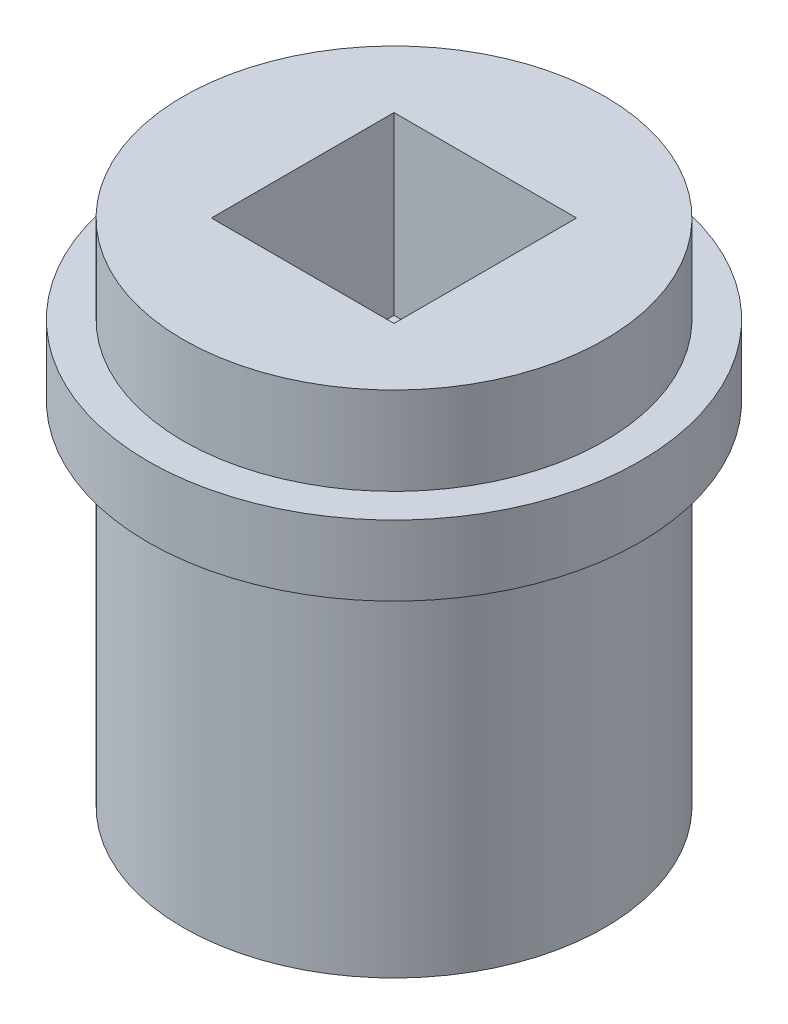
ISO-10303-21;
HEADER;
FILE_DESCRIPTION(('STEP AP214'),'2;1');
FILE_NAME('part.step','',(''),(''),'','','');
FILE_SCHEMA(('AUTOMOTIVE_DESIGN { 1 0 10303 214 1 1 1 1 }'));
ENDSEC;
DATA;
#1=APPLICATION_CONTEXT('core data for automotive mechanical design processes');
#2=APPLICATION_PROTOCOL_DEFINITION('international standard','automotive_design',2000,#1);
#3=PRODUCT_CONTEXT('',#1,'mechanical');
#4=PRODUCT('Part','Part','',(#3));
#5=PRODUCT_RELATED_PRODUCT_CATEGORY('part','',(#4));
#6=PRODUCT_DEFINITION_FORMATION('','',#4);
#7=PRODUCT_DEFINITION_CONTEXT('part definition',#1,'design');
#8=PRODUCT_DEFINITION('design','',#6,#7);
#9=PRODUCT_DEFINITION_SHAPE('','',#8);
#10=(LENGTH_UNIT() NAMED_UNIT(*) SI_UNIT(.MILLI.,.METRE.));
#11=(NAMED_UNIT(*) PLANE_ANGLE_UNIT() SI_UNIT($,.RADIAN.));
#12=(NAMED_UNIT(*) SI_UNIT($,.STERADIAN.) SOLID_ANGLE_UNIT());
#13=UNCERTAINTY_MEASURE_WITH_UNIT(LENGTH_MEASURE(1.E-05),#10,'distance_accuracy_value','');
#14=(GEOMETRIC_REPRESENTATION_CONTEXT(3) GLOBAL_UNCERTAINTY_ASSIGNED_CONTEXT((#13)) GLOBAL_UNIT_ASSIGNED_CONTEXT((#10,
#11,#12)) REPRESENTATION_CONTEXT('',''));
#15=CARTESIAN_POINT('',(0.,0.,0.));
#16=DIRECTION('',(0.,0.,1.));
#17=DIRECTION('',(1.,0.,0.));
#18=AXIS2_PLACEMENT_3D('',#15,#16,#17);
#19=CARTESIAN_POINT('',(0.,7.25,0.));
#20=DIRECTION('',(0.,1.,0.));
#21=DIRECTION('',(0.,0.,1.));
#22=AXIS2_PLACEMENT_3D('',#19,#20,#21);
#23=PLANE('',#22);
#24=CARTESIAN_POINT('',(0.,7.25,0.));
#25=DIRECTION('',(0.,1.,0.));
#26=DIRECTION('',(0.,0.,1.));
#27=AXIS2_PLACEMENT_3D('',#24,#25,#26);
#28=CIRCLE('',#27,3.);
#29=CARTESIAN_POINT('',(0.,7.25,-3.));
#30=VERTEX_POINT('',#29);
#31=EDGE_CURVE('E46',#30,#30,#28,.T.);
#32=ORIENTED_EDGE('',*,*,#31,.T.);
#33=EDGE_LOOP('',(#32));
#34=FACE_BOUND('',#33,.T.);
#35=DIRECTION('',(0.,0.,-1.));
#36=VECTOR('',#35,1.);
#37=CARTESIAN_POINT('',(-1.3,7.25,1.3));
#38=LINE('',#37,#36);
#39=CARTESIAN_POINT('',(-1.3,7.25,1.3));
#40=VERTEX_POINT('',#39);
#41=CARTESIAN_POINT('',(-1.3,7.25,-1.3));
#42=VERTEX_POINT('',#41);
#43=EDGE_CURVE('E111',#40,#42,#38,.T.);
#44=ORIENTED_EDGE('',*,*,#43,.T.);
#45=DIRECTION('',(1.,0.,0.));
#46=VECTOR('',#45,1.);
#47=CARTESIAN_POINT('',(-1.3,7.25,-1.3));
#48=LINE('',#47,#46);
#49=CARTESIAN_POINT('',(1.3,7.25,-1.3));
#50=VERTEX_POINT('',#49);
#51=EDGE_CURVE('E53',#42,#50,#48,.T.);
#52=ORIENTED_EDGE('',*,*,#51,.T.);
#53=DIRECTION('',(0.,0.,-1.));
#54=VECTOR('',#53,1.);
#55=CARTESIAN_POINT('',(1.3,7.25,1.3));
#56=LINE('',#55,#54);
#57=CARTESIAN_POINT('',(1.3,7.25,1.3));
#58=VERTEX_POINT('',#57);
#59=EDGE_CURVE('E108',#58,#50,#56,.T.);
#60=ORIENTED_EDGE('',*,*,#59,.F.);
#61=DIRECTION('',(1.,0.,0.));
#62=VECTOR('',#61,1.);
#63=CARTESIAN_POINT('',(-1.3,7.25,1.3));
#64=LINE('',#63,#62);
#65=EDGE_CURVE('E90',#40,#58,#64,.T.);
#66=ORIENTED_EDGE('',*,*,#65,.F.);
#67=EDGE_LOOP('',(#44,#52,#60,#66));
#68=FACE_BOUND('',#67,.T.);
#69=ADVANCED_FACE('F37',(#34,#68),#23,.T.);
#70=CARTESIAN_POINT('',(0.,7.25,0.));
#71=DIRECTION('',(0.,-1.,0.));
#72=DIRECTION('',(0.,0.,-1.));
#73=AXIS2_PLACEMENT_3D('',#70,#71,#72);
#74=CYLINDRICAL_SURFACE('',#73,3.);
#75=CARTESIAN_POINT('',(0.,6.,0.));
#76=DIRECTION('',(0.,1.,0.));
#77=DIRECTION('',(0.,0.,1.));
#78=AXIS2_PLACEMENT_3D('',#75,#76,#77);
#79=CIRCLE('',#78,3.);
#80=CARTESIAN_POINT('',(0.,6.,-3.));
#81=VERTEX_POINT('',#80);
#82=EDGE_CURVE('E41',#81,#81,#79,.T.);
#83=CARTESIAN_POINT('',(0.,6.,-3.));
#84=CARTESIAN_POINT('',(0.,6.01302083333333,-3.));
#85=CARTESIAN_POINT('',(0.,6.02604166666667,-3.));
#86=CARTESIAN_POINT('',(0.,6.05208333333333,-3.));
#87=CARTESIAN_POINT('',(0.,6.06510416666667,-3.));
#88=CARTESIAN_POINT('',(0.,6.09114583333333,-3.));
#89=CARTESIAN_POINT('',(0.,6.10416666666667,-3.));
#90=CARTESIAN_POINT('',(0.,6.13020833333333,-3.));
#91=CARTESIAN_POINT('',(0.,6.14322916666667,-3.));
#92=CARTESIAN_POINT('',(0.,6.16927083333333,-3.));
#93=CARTESIAN_POINT('',(0.,6.18229166666667,-3.));
#94=CARTESIAN_POINT('',(0.,6.20833333333333,-3.));
#95=CARTESIAN_POINT('',(0.,6.22135416666667,-3.));
#96=CARTESIAN_POINT('',(0.,6.24739583333333,-3.));
#97=CARTESIAN_POINT('',(0.,6.26041666666667,-3.));
#98=CARTESIAN_POINT('',(0.,6.28645833333333,-3.));
#99=CARTESIAN_POINT('',(0.,6.29947916666667,-3.));
#100=CARTESIAN_POINT('',(0.,6.32552083333333,-3.));
#101=CARTESIAN_POINT('',(0.,6.33854166666667,-3.));
#102=CARTESIAN_POINT('',(0.,6.36458333333333,-3.));
#103=CARTESIAN_POINT('',(0.,6.37760416666667,-3.));
#104=CARTESIAN_POINT('',(0.,6.40364583333333,-3.));
#105=CARTESIAN_POINT('',(0.,6.41666666666667,-3.));
#106=CARTESIAN_POINT('',(0.,6.44270833333333,-3.));
#107=CARTESIAN_POINT('',(0.,6.45572916666667,-3.));
#108=CARTESIAN_POINT('',(0.,6.48177083333333,-3.));
#109=CARTESIAN_POINT('',(0.,6.49479166666667,-3.));
#110=CARTESIAN_POINT('',(0.,6.52083333333333,-3.));
#111=CARTESIAN_POINT('',(0.,6.53385416666667,-3.));
#112=CARTESIAN_POINT('',(0.,6.55989583333333,-3.));
#113=CARTESIAN_POINT('',(0.,6.57291666666667,-3.));
#114=CARTESIAN_POINT('',(0.,6.59895833333333,-3.));
#115=CARTESIAN_POINT('',(0.,6.61197916666667,-3.));
#116=CARTESIAN_POINT('',(0.,6.63802083333333,-3.));
#117=CARTESIAN_POINT('',(0.,6.65104166666667,-3.));
#118=CARTESIAN_POINT('',(0.,6.67708333333333,-3.));
#119=CARTESIAN_POINT('',(0.,6.69010416666667,-3.));
#120=CARTESIAN_POINT('',(0.,6.71614583333333,-3.));
#121=CARTESIAN_POINT('',(0.,6.72916666666667,-3.));
#122=CARTESIAN_POINT('',(0.,6.75520833333333,-3.));
#123=CARTESIAN_POINT('',(0.,6.76822916666667,-3.));
#124=CARTESIAN_POINT('',(0.,6.79427083333333,-3.));
#125=CARTESIAN_POINT('',(0.,6.80729166666667,-3.));
#126=CARTESIAN_POINT('',(0.,6.83333333333333,-3.));
#127=CARTESIAN_POINT('',(0.,6.84635416666667,-3.));
#128=CARTESIAN_POINT('',(0.,6.87239583333333,-3.));
#129=CARTESIAN_POINT('',(0.,6.88541666666667,-3.));
#130=CARTESIAN_POINT('',(0.,6.91145833333333,-3.));
#131=CARTESIAN_POINT('',(0.,6.92447916666667,-3.));
#132=CARTESIAN_POINT('',(0.,6.95052083333333,-3.));
#133=CARTESIAN_POINT('',(0.,6.96354166666667,-3.));
#134=CARTESIAN_POINT('',(0.,6.98958333333333,-3.));
#135=CARTESIAN_POINT('',(0.,7.00260416666667,-3.));
#136=CARTESIAN_POINT('',(0.,7.02864583333333,-3.));
#137=CARTESIAN_POINT('',(0.,7.04166666666667,-3.));
#138=CARTESIAN_POINT('',(0.,7.06770833333333,-3.));
#139=CARTESIAN_POINT('',(0.,7.08072916666667,-3.));
#140=CARTESIAN_POINT('',(0.,7.10677083333333,-3.));
#141=CARTESIAN_POINT('',(0.,7.11979166666667,-3.));
#142=CARTESIAN_POINT('',(0.,7.14583333333333,-3.));
#143=CARTESIAN_POINT('',(0.,7.15885416666667,-3.));
#144=CARTESIAN_POINT('',(0.,7.18489583333333,-3.));
#145=CARTESIAN_POINT('',(0.,7.19791666666667,-3.));
#146=CARTESIAN_POINT('',(0.,7.22395833333333,-3.));
#147=CARTESIAN_POINT('',(0.,7.23697916666667,-3.));
#148=CARTESIAN_POINT('',(0.,7.25,-3.));
#149=B_SPLINE_CURVE_WITH_KNOTS('',3,(#83,#84,#85,#86,#87,#88,#89,#90,#91,#92,#93,#94,#95,#96,
#97,#98,#99,#100,#101,#102,#103,#104,#105,#106,#107,#108,#109,#110,#111,#112,#113,#114,#115,
#116,#117,#118,#119,#120,#121,#122,#123,#124,#125,#126,#127,#128,#129,#130,#131,#132,#133,#134,
#135,#136,#137,#138,#139,#140,#141,#142,#143,#144,#145,#146,#147,#148),.UNSPECIFIED.,.F.,.F.,(4,
2,2,2,2,2,2,2,2,2,2,2,2,2,2,2,2,2,2,2,2,2,2,2,2,2,2,2,2,2,2,2,4),(0.,0.0390625,
0.0781250000000001,0.1171875,0.15625,0.1953125,0.234375,0.2734375,0.3125,0.3515625,0.390625,
0.4296875,0.46875,0.5078125,0.546875,0.585937500000001,0.625000000000001,0.664062500000001,
0.703125000000001,0.742187500000001,0.781250000000001,0.820312500000001,0.859375000000001,
0.898437500000001,0.937500000000001,0.976562500000001,1.015625,1.0546875,1.09375,1.1328125,
1.171875,1.2109375,1.25),.UNSPECIFIED.);
#150=EDGE_CURVE('BSEAM39',#81,#30,#149,.T.);
#151=ORIENTED_EDGE('',*,*,#82,.T.);
#152=ORIENTED_EDGE('',*,*,#31,.F.);
#153=ORIENTED_EDGE('',*,*,#150,.T.);
#154=ORIENTED_EDGE('',*,*,#150,.F.);
#155=EDGE_LOOP('',(#151,#153,#152,#154));
#156=FACE_BOUND('',#155,.T.);
#157=ADVANCED_FACE('F39',(#156),#74,.T.);
#158=CARTESIAN_POINT('',(0.,6.,0.));
#159=DIRECTION('',(0.,-1.,0.));
#160=DIRECTION('',(0.,0.,-1.));
#161=AXIS2_PLACEMENT_3D('',#158,#159,#160);
#162=CYLINDRICAL_SURFACE('',#161,3.5);
#163=CARTESIAN_POINT('',(0.,6.,0.));
#164=DIRECTION('',(0.,1.,0.));
#165=DIRECTION('',(0.,0.,1.));
#166=AXIS2_PLACEMENT_3D('',#163,#164,#165);
#167=CIRCLE('',#166,3.5);
#168=CARTESIAN_POINT('',(0.,6.,3.5));
#169=VERTEX_POINT('',#168);
#170=EDGE_CURVE('E118',#169,#169,#167,.T.);
#171=ORIENTED_EDGE('',*,*,#170,.F.);
#172=EDGE_LOOP('',(#171));
#173=FACE_BOUND('',#172,.T.);
#174=CARTESIAN_POINT('',(0.,5.,0.));
#175=DIRECTION('',(0.,1.,0.));
#176=DIRECTION('',(0.,0.,1.));
#177=AXIS2_PLACEMENT_3D('',#174,#175,#176);
#178=CIRCLE('',#177,3.5);
#179=CARTESIAN_POINT('',(0.,5.,3.5));
#180=VERTEX_POINT('',#179);
#181=EDGE_CURVE('E117',#180,#180,#178,.T.);
#182=ORIENTED_EDGE('',*,*,#181,.T.);
#183=EDGE_LOOP('',(#182));
#184=FACE_BOUND('',#183,.T.);
#185=ADVANCED_FACE('F138',(#173,#184),#162,.T.);
#186=CARTESIAN_POINT('',(0.,6.,0.));
#187=DIRECTION('',(0.,1.,0.));
#188=DIRECTION('',(0.,0.,1.));
#189=AXIS2_PLACEMENT_3D('',#186,#187,#188);
#190=PLANE('',#189);
#191=ORIENTED_EDGE('',*,*,#82,.F.);
#192=EDGE_LOOP('',(#191));
#193=FACE_BOUND('',#192,.T.);
#194=ORIENTED_EDGE('',*,*,#170,.T.);
#195=EDGE_LOOP('',(#194));
#196=FACE_BOUND('',#195,.T.);
#197=ADVANCED_FACE('F134',(#193,#196),#190,.T.);
#198=CARTESIAN_POINT('',(0.,5.,0.));
#199=DIRECTION('',(0.,1.,0.));
#200=DIRECTION('',(0.,0.,1.));
#201=AXIS2_PLACEMENT_3D('',#198,#199,#200);
#202=PLANE('',#201);
#203=CARTESIAN_POINT('',(0.,5.,0.));
#204=DIRECTION('',(0.,1.,0.));
#205=DIRECTION('',(0.,0.,1.));
#206=AXIS2_PLACEMENT_3D('',#203,#204,#205);
#207=CIRCLE('',#206,3.);
#208=CARTESIAN_POINT('',(0.,5.,-3.));
#209=VERTEX_POINT('',#208);
#210=EDGE_CURVE('E11',#209,#209,#207,.T.);
#211=ORIENTED_EDGE('',*,*,#210,.T.);
#212=EDGE_LOOP('',(#211));
#213=FACE_BOUND('',#212,.T.);
#214=ORIENTED_EDGE('',*,*,#181,.F.);
#215=EDGE_LOOP('',(#214));
#216=FACE_BOUND('',#215,.T.);
#217=ADVANCED_FACE('F137',(#213,#216),#202,.F.);
#218=CARTESIAN_POINT('',(0.,0.,0.));
#219=DIRECTION('',(0.,1.,0.));
#220=DIRECTION('',(0.,0.,1.));
#221=AXIS2_PLACEMENT_3D('',#218,#219,#220);
#222=PLANE('',#221);
#223=CARTESIAN_POINT('',(0.,0.,0.));
#224=DIRECTION('',(0.,1.,0.));
#225=DIRECTION('',(0.,0.,1.));
#226=AXIS2_PLACEMENT_3D('',#223,#224,#225);
#227=CIRCLE('',#226,3.);
#228=CARTESIAN_POINT('',(0.,0.,-3.));
#229=VERTEX_POINT('',#228);
#230=EDGE_CURVE('E125',#229,#229,#227,.T.);
#231=ORIENTED_EDGE('',*,*,#230,.F.);
#232=EDGE_LOOP('',(#231));
#233=FACE_BOUND('',#232,.T.);
#234=ADVANCED_FACE('F148',(#233),#222,.F.);
#235=CARTESIAN_POINT('',(0.,0.,-3.));
#236=CARTESIAN_POINT('',(0.,0.0520833333333334,-3.));
#237=CARTESIAN_POINT('',(0.,0.104166666666667,-3.));
#238=CARTESIAN_POINT('',(0.,0.208333333333334,-3.));
#239=CARTESIAN_POINT('',(0.,0.260416666666667,-3.));
#240=CARTESIAN_POINT('',(0.,0.364583333333334,-3.));
#241=CARTESIAN_POINT('',(0.,0.416666666666667,-3.));
#242=CARTESIAN_POINT('',(0.,0.520833333333334,-3.));
#243=CARTESIAN_POINT('',(0.,0.572916666666667,-3.));
#244=CARTESIAN_POINT('',(0.,0.677083333333333,-3.));
#245=CARTESIAN_POINT('',(0.,0.729166666666667,-3.));
#246=CARTESIAN_POINT('',(0.,0.833333333333333,-3.));
#247=CARTESIAN_POINT('',(0.,0.885416666666667,-3.));
#248=CARTESIAN_POINT('',(0.,0.989583333333333,-3.));
#249=CARTESIAN_POINT('',(0.,1.04166666666667,-3.));
#250=CARTESIAN_POINT('',(0.,1.14583333333333,-3.));
#251=CARTESIAN_POINT('',(0.,1.19791666666667,-3.));
#252=CARTESIAN_POINT('',(0.,1.30208333333333,-3.));
#253=CARTESIAN_POINT('',(0.,1.35416666666667,-3.));
#254=CARTESIAN_POINT('',(0.,1.45833333333333,-3.));
#255=CARTESIAN_POINT('',(0.,1.51041666666667,-3.));
#256=CARTESIAN_POINT('',(0.,1.61458333333333,-3.));
#257=CARTESIAN_POINT('',(0.,1.66666666666667,-3.));
#258=CARTESIAN_POINT('',(0.,1.77083333333333,-3.));
#259=CARTESIAN_POINT('',(0.,1.82291666666667,-3.));
#260=CARTESIAN_POINT('',(0.,1.92708333333333,-3.));
#261=CARTESIAN_POINT('',(0.,1.97916666666667,-3.));
#262=CARTESIAN_POINT('',(0.,2.08333333333333,-3.));
#263=CARTESIAN_POINT('',(0.,2.13541666666667,-3.));
#264=CARTESIAN_POINT('',(0.,2.23958333333333,-3.));
#265=CARTESIAN_POINT('',(0.,2.29166666666667,-3.));
#266=CARTESIAN_POINT('',(0.,2.39583333333333,-3.));
#267=CARTESIAN_POINT('',(0.,2.44791666666667,-3.));
#268=CARTESIAN_POINT('',(0.,2.55208333333333,-3.));
#269=CARTESIAN_POINT('',(0.,2.60416666666667,-3.));
#270=CARTESIAN_POINT('',(0.,2.70833333333333,-3.));
#271=CARTESIAN_POINT('',(0.,2.76041666666667,-3.));
#272=CARTESIAN_POINT('',(0.,2.86458333333333,-3.));
#273=CARTESIAN_POINT('',(0.,2.91666666666667,-3.));
#274=CARTESIAN_POINT('',(0.,3.02083333333333,-3.));
#275=CARTESIAN_POINT('',(0.,3.07291666666667,-3.));
#276=CARTESIAN_POINT('',(0.,3.17708333333333,-3.));
#277=CARTESIAN_POINT('',(0.,3.22916666666667,-3.));
#278=CARTESIAN_POINT('',(0.,3.33333333333333,-3.));
#279=CARTESIAN_POINT('',(0.,3.38541666666667,-3.));
#280=CARTESIAN_POINT('',(0.,3.48958333333333,-3.));
#281=CARTESIAN_POINT('',(0.,3.54166666666667,-3.));
#282=CARTESIAN_POINT('',(0.,3.64583333333333,-3.));
#283=CARTESIAN_POINT('',(0.,3.69791666666667,-3.));
#284=CARTESIAN_POINT('',(0.,3.80208333333333,-3.));
#285=CARTESIAN_POINT('',(0.,3.85416666666667,-3.));
#286=CARTESIAN_POINT('',(0.,3.95833333333333,-3.));
#287=CARTESIAN_POINT('',(0.,4.01041666666667,-3.));
#288=CARTESIAN_POINT('',(0.,4.11458333333333,-3.));
#289=CARTESIAN_POINT('',(0.,4.16666666666667,-3.));
#290=CARTESIAN_POINT('',(0.,4.27083333333333,-3.));
#291=CARTESIAN_POINT('',(0.,4.32291666666667,-3.));
#292=CARTESIAN_POINT('',(0.,4.42708333333333,-3.));
#293=CARTESIAN_POINT('',(0.,4.47916666666667,-3.));
#294=CARTESIAN_POINT('',(0.,4.58333333333333,-3.));
#295=CARTESIAN_POINT('',(0.,4.63541666666667,-3.));
#296=CARTESIAN_POINT('',(0.,4.73958333333333,-3.));
#297=CARTESIAN_POINT('',(0.,4.79166666666667,-3.));
#298=CARTESIAN_POINT('',(0.,4.89583333333333,-3.));
#299=CARTESIAN_POINT('',(0.,4.94791666666667,-3.));
#300=CARTESIAN_POINT('',(0.,5.,-3.));
#301=B_SPLINE_CURVE_WITH_KNOTS('',3,(#235,#236,#237,#238,#239,#240,#241,#242,#243,#244,#245,
#246,#247,#248,#249,#250,#251,#252,#253,#254,#255,#256,#257,#258,#259,#260,#261,#262,#263,#264,
#265,#266,#267,#268,#269,#270,#271,#272,#273,#274,#275,#276,#277,#278,#279,#280,#281,#282,#283,
#284,#285,#286,#287,#288,#289,#290,#291,#292,#293,#294,#295,#296,#297,#298,#299,#300),
.UNSPECIFIED.,.F.,.F.,(4,2,2,2,2,2,2,2,2,2,2,2,2,2,2,2,2,2,2,2,2,2,2,2,2,2,2,2,2,2,2,2,4),(0.,
0.15625,0.3125,0.46875,0.625,0.78125,0.9375,1.09375,1.25,1.40625,1.5625,1.71875,1.875,2.03125,
2.1875,2.34375,2.5,2.65625,2.8125,2.96875,3.125,3.28125,3.4375,3.59375,3.75,3.90625,4.0625,
4.21875,4.375,4.53125,4.6875,4.84375,5.),.UNSPECIFIED.);
#302=EDGE_CURVE('BSEAM154',#229,#209,#301,.T.);
#303=ORIENTED_EDGE('',*,*,#230,.T.);
#304=ORIENTED_EDGE('',*,*,#210,.F.);
#305=ORIENTED_EDGE('',*,*,#302,.T.);
#306=ORIENTED_EDGE('',*,*,#302,.F.);
#307=EDGE_LOOP('',(#303,#305,#304,#306));
#308=FACE_BOUND('',#307,.T.);
#309=ADVANCED_FACE('F154',(#308),#74,.T.);
#310=CARTESIAN_POINT('',(-1.3,4.75,-1.3));
#311=DIRECTION('',(0.,0.,1.));
#312=DIRECTION('',(1.,0.,0.));
#313=AXIS2_PLACEMENT_3D('',#310,#311,#312);
#314=PLANE('',#313);
#315=ORIENTED_EDGE('',*,*,#51,.F.);
#316=DIRECTION('',(0.,1.,0.));
#317=VECTOR('',#316,1.);
#318=CARTESIAN_POINT('',(-1.3,4.75,-1.3));
#319=LINE('',#318,#317);
#320=CARTESIAN_POINT('',(-1.3,4.75,-1.3));
#321=VERTEX_POINT('',#320);
#322=EDGE_CURVE('E103',#321,#42,#319,.T.);
#323=ORIENTED_EDGE('',*,*,#322,.F.);
#324=DIRECTION('',(1.,0.,0.));
#325=VECTOR('',#324,1.);
#326=CARTESIAN_POINT('',(-1.3,4.75,-1.3));
#327=LINE('',#326,#325);
#328=CARTESIAN_POINT('',(1.3,4.75,-1.3));
#329=VERTEX_POINT('',#328);
#330=EDGE_CURVE('E81',#321,#329,#327,.T.);
#331=ORIENTED_EDGE('',*,*,#330,.T.);
#332=DIRECTION('',(0.,1.,0.));
#333=VECTOR('',#332,1.);
#334=CARTESIAN_POINT('',(1.3,4.75,-1.3));
#335=LINE('',#334,#333);
#336=EDGE_CURVE('E94',#329,#50,#335,.T.);
#337=ORIENTED_EDGE('',*,*,#336,.T.);
#338=EDGE_LOOP('',(#315,#323,#331,#337));
#339=FACE_BOUND('',#338,.T.);
#340=ADVANCED_FACE('F165',(#339),#314,.T.);
#341=CARTESIAN_POINT('',(1.3,4.75,1.3));
#342=DIRECTION('',(1.,0.,0.));
#343=DIRECTION('',(0.,0.,-1.));
#344=AXIS2_PLACEMENT_3D('',#341,#342,#343);
#345=PLANE('',#344);
#346=ORIENTED_EDGE('',*,*,#59,.T.);
#347=ORIENTED_EDGE('',*,*,#336,.F.);
#348=DIRECTION('',(0.,0.,-1.));
#349=VECTOR('',#348,1.);
#350=CARTESIAN_POINT('',(1.3,4.75,1.3));
#351=LINE('',#350,#349);
#352=CARTESIAN_POINT('',(1.3,4.75,1.3));
#353=VERTEX_POINT('',#352);
#354=EDGE_CURVE('E97',#353,#329,#351,.T.);
#355=ORIENTED_EDGE('',*,*,#354,.F.);
#356=DIRECTION('',(0.,1.,0.));
#357=VECTOR('',#356,1.);
#358=CARTESIAN_POINT('',(1.3,4.75,1.3));
#359=LINE('',#358,#357);
#360=EDGE_CURVE('E84',#353,#58,#359,.T.);
#361=ORIENTED_EDGE('',*,*,#360,.T.);
#362=EDGE_LOOP('',(#346,#347,#355,#361));
#363=FACE_BOUND('',#362,.T.);
#364=ADVANCED_FACE('F98',(#363),#345,.F.);
#365=CARTESIAN_POINT('',(-1.3,4.75,1.3));
#366=DIRECTION('',(0.,0.,1.));
#367=DIRECTION('',(1.,0.,0.));
#368=AXIS2_PLACEMENT_3D('',#365,#366,#367);
#369=PLANE('',#368);
#370=ORIENTED_EDGE('',*,*,#65,.T.);
#371=ORIENTED_EDGE('',*,*,#360,.F.);
#372=DIRECTION('',(1.,0.,0.));
#373=VECTOR('',#372,1.);
#374=CARTESIAN_POINT('',(-1.3,4.75,1.3));
#375=LINE('',#374,#373);
#376=CARTESIAN_POINT('',(-1.3,4.75,1.3));
#377=VERTEX_POINT('',#376);
#378=EDGE_CURVE('E88',#377,#353,#375,.T.);
#379=ORIENTED_EDGE('',*,*,#378,.F.);
#380=DIRECTION('',(0.,1.,0.));
#381=VECTOR('',#380,1.);
#382=CARTESIAN_POINT('',(-1.3,4.75,1.3));
#383=LINE('',#382,#381);
#384=EDGE_CURVE('E76',#377,#40,#383,.T.);
#385=ORIENTED_EDGE('',*,*,#384,.T.);
#386=EDGE_LOOP('',(#370,#371,#379,#385));
#387=FACE_BOUND('',#386,.T.);
#388=ADVANCED_FACE('F86',(#387),#369,.F.);
#389=CARTESIAN_POINT('',(-1.3,4.75,1.3));
#390=DIRECTION('',(1.,0.,0.));
#391=DIRECTION('',(0.,0.,-1.));
#392=AXIS2_PLACEMENT_3D('',#389,#390,#391);
#393=PLANE('',#392);
#394=ORIENTED_EDGE('',*,*,#43,.F.);
#395=ORIENTED_EDGE('',*,*,#384,.F.);
#396=DIRECTION('',(0.,0.,-1.));
#397=VECTOR('',#396,1.);
#398=CARTESIAN_POINT('',(-1.3,4.75,1.3));
#399=LINE('',#398,#397);
#400=EDGE_CURVE('E61',#377,#321,#399,.T.);
#401=ORIENTED_EDGE('',*,*,#400,.T.);
#402=ORIENTED_EDGE('',*,*,#322,.T.);
#403=EDGE_LOOP('',(#394,#395,#401,#402));
#404=FACE_BOUND('',#403,.T.);
#405=ADVANCED_FACE('F164',(#404),#393,.T.);
#406=CARTESIAN_POINT('',(0.,4.75,0.));
#407=DIRECTION('',(0.,1.,0.));
#408=DIRECTION('',(0.,0.,1.));
#409=AXIS2_PLACEMENT_3D('',#406,#407,#408);
#410=PLANE('',#409);
#411=ORIENTED_EDGE('',*,*,#330,.F.);
#412=ORIENTED_EDGE('',*,*,#400,.F.);
#413=ORIENTED_EDGE('',*,*,#378,.T.);
#414=ORIENTED_EDGE('',*,*,#354,.T.);
#415=EDGE_LOOP('',(#411,#412,#413,#414));
#416=FACE_BOUND('',#415,.T.);
#417=ADVANCED_FACE('F101',(#416),#410,.T.);
#418=CLOSED_SHELL('',(#69,#157,#185,#197,#217,#234,#309,#340,#364,#388,#405,#417));
#419=MANIFOLD_SOLID_BREP('B2',#418);
#420=ADVANCED_BREP_SHAPE_REPRESENTATION('',(#18,#419),#14);
#421=SHAPE_DEFINITION_REPRESENTATION(#9,#420);
ENDSEC;
END-ISO-10303-21;
